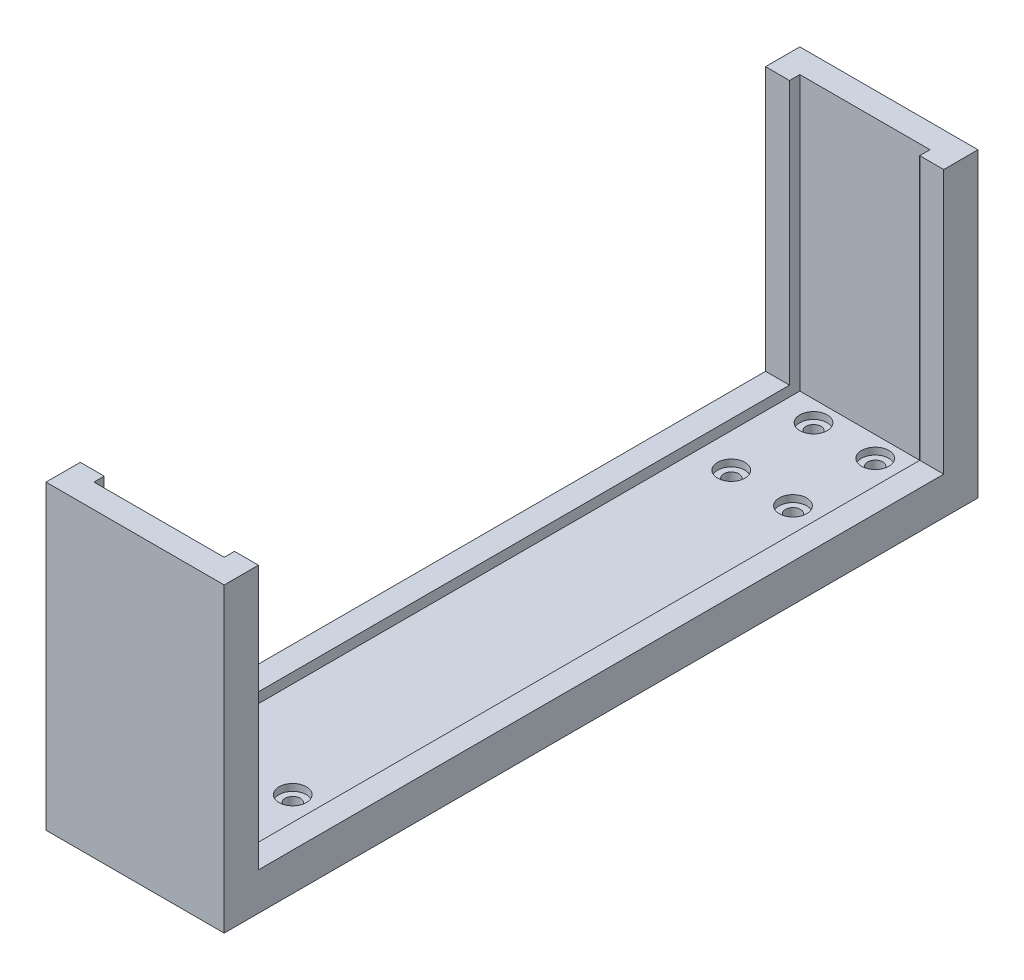
ISO-10303-21;
HEADER;
FILE_DESCRIPTION(('STEP AP214'),'2;1');
FILE_NAME('part.step','',(''),(''),'','','');
FILE_SCHEMA(('AUTOMOTIVE_DESIGN { 1 0 10303 214 1 1 1 1 }'));
ENDSEC;
DATA;
#1=APPLICATION_CONTEXT('core data for automotive mechanical design processes');
#2=APPLICATION_PROTOCOL_DEFINITION('international standard','automotive_design',2000,#1);
#3=PRODUCT_CONTEXT('',#1,'mechanical');
#4=PRODUCT('Part','Part','',(#3));
#5=PRODUCT_RELATED_PRODUCT_CATEGORY('part','',(#4));
#6=PRODUCT_DEFINITION_FORMATION('','',#4);
#7=PRODUCT_DEFINITION_CONTEXT('part definition',#1,'design');
#8=PRODUCT_DEFINITION('design','',#6,#7);
#9=PRODUCT_DEFINITION_SHAPE('','',#8);
#10=(LENGTH_UNIT() NAMED_UNIT(*) SI_UNIT(.MILLI.,.METRE.));
#11=(NAMED_UNIT(*) PLANE_ANGLE_UNIT() SI_UNIT($,.RADIAN.));
#12=(NAMED_UNIT(*) SI_UNIT($,.STERADIAN.) SOLID_ANGLE_UNIT());
#13=UNCERTAINTY_MEASURE_WITH_UNIT(LENGTH_MEASURE(1.E-05),#10,'distance_accuracy_value','');
#14=(GEOMETRIC_REPRESENTATION_CONTEXT(3) GLOBAL_UNCERTAINTY_ASSIGNED_CONTEXT((#13)) GLOBAL_UNIT_ASSIGNED_CONTEXT((#10,
#11,#12)) REPRESENTATION_CONTEXT('',''));
#15=CARTESIAN_POINT('',(0.,0.,0.));
#16=DIRECTION('',(0.,0.,1.));
#17=DIRECTION('',(1.,0.,0.));
#18=AXIS2_PLACEMENT_3D('',#15,#16,#17);
#19=CARTESIAN_POINT('',(24.761174554452,8.,154.057839406179));
#20=DIRECTION('',(0.,-1.,0.));
#21=DIRECTION('',(0.,0.,-1.));
#22=AXIS2_PLACEMENT_3D('',#19,#20,#21);
#23=CYLINDRICAL_SURFACE('',#22,2.2);
#24=CARTESIAN_POINT('',(24.761174554452,0.,154.057839406179));
#25=DIRECTION('',(0.,-1.,0.));
#26=DIRECTION('',(0.,0.,-1.));
#27=AXIS2_PLACEMENT_3D('',#24,#25,#26);
#28=CIRCLE('',#27,2.2);
#29=CARTESIAN_POINT('',(24.761174554452,0.,151.857839406179));
#30=VERTEX_POINT('',#29);
#31=EDGE_CURVE('E225',#30,#30,#28,.T.);
#32=ORIENTED_EDGE('',*,*,#31,.T.);
#33=EDGE_LOOP('',(#32));
#34=FACE_BOUND('',#33,.T.);
#35=CARTESIAN_POINT('',(24.761174554452,6.,154.057839406179));
#36=DIRECTION('',(0.,1.,0.));
#37=DIRECTION('',(0.,0.,1.));
#38=AXIS2_PLACEMENT_3D('',#35,#36,#37);
#39=CIRCLE('',#38,2.2);
#40=CARTESIAN_POINT('',(24.761174554452,6.,156.257839406179));
#41=VERTEX_POINT('',#40);
#42=EDGE_CURVE('E39',#41,#41,#39,.F.);
#43=ORIENTED_EDGE('',*,*,#42,.F.);
#44=EDGE_LOOP('',(#43));
#45=FACE_BOUND('',#44,.T.);
#46=ADVANCED_FACE('F35',(#34,#45),#23,.F.);
#47=CARTESIAN_POINT('',(24.7611745544548,8.,-39.9421605938213));
#48=DIRECTION('',(0.,-1.,0.));
#49=DIRECTION('',(0.,0.,-1.));
#50=AXIS2_PLACEMENT_3D('',#47,#48,#49);
#51=CYLINDRICAL_SURFACE('',#50,2.19999999999861);
#52=CARTESIAN_POINT('',(24.7611745544548,0.,-39.9421605938213));
#53=DIRECTION('',(0.,-1.,0.));
#54=DIRECTION('',(0.,0.,-1.));
#55=AXIS2_PLACEMENT_3D('',#52,#53,#54);
#56=CIRCLE('',#55,2.19999999999861);
#57=CARTESIAN_POINT('',(24.7611745544548,0.,-42.1421605938199));
#58=VERTEX_POINT('',#57);
#59=EDGE_CURVE('E212',#58,#58,#56,.T.);
#60=ORIENTED_EDGE('',*,*,#59,.T.);
#61=EDGE_LOOP('',(#60));
#62=FACE_BOUND('',#61,.T.);
#63=CARTESIAN_POINT('',(24.7611745544548,6.,-39.9421605938213));
#64=DIRECTION('',(0.,1.,0.));
#65=DIRECTION('',(0.,0.,1.));
#66=AXIS2_PLACEMENT_3D('',#63,#64,#65);
#67=CIRCLE('',#66,2.19999999999861);
#68=CARTESIAN_POINT('',(24.7611745544548,6.,-37.7421605938227));
#69=VERTEX_POINT('',#68);
#70=EDGE_CURVE('E172',#69,#69,#67,.F.);
#71=ORIENTED_EDGE('',*,*,#70,.F.);
#72=EDGE_LOOP('',(#71));
#73=FACE_BOUND('',#72,.T.);
#74=ADVANCED_FACE('F326',(#62,#73),#51,.F.);
#75=CARTESIAN_POINT('',(42.7611745544548,8.,-39.9421605938212));
#76=DIRECTION('',(0.,-1.,0.));
#77=DIRECTION('',(0.,0.,-1.));
#78=AXIS2_PLACEMENT_3D('',#75,#76,#77);
#79=CYLINDRICAL_SURFACE('',#78,2.19999999999861);
#80=CARTESIAN_POINT('',(42.7611745544548,0.,-39.9421605938212));
#81=DIRECTION('',(0.,-1.,0.));
#82=DIRECTION('',(0.,0.,-1.));
#83=AXIS2_PLACEMENT_3D('',#80,#81,#82);
#84=CIRCLE('',#83,2.19999999999861);
#85=CARTESIAN_POINT('',(42.7611745544548,0.,-42.1421605938198));
#86=VERTEX_POINT('',#85);
#87=EDGE_CURVE('E217',#86,#86,#84,.T.);
#88=ORIENTED_EDGE('',*,*,#87,.T.);
#89=EDGE_LOOP('',(#88));
#90=FACE_BOUND('',#89,.T.);
#91=CARTESIAN_POINT('',(42.7611745544548,6.,-39.9421605938212));
#92=DIRECTION('',(0.,1.,0.));
#93=DIRECTION('',(0.,0.,1.));
#94=AXIS2_PLACEMENT_3D('',#91,#92,#93);
#95=CIRCLE('',#94,2.19999999999861);
#96=CARTESIAN_POINT('',(42.7611745544548,6.,-37.7421605938226));
#97=VERTEX_POINT('',#96);
#98=EDGE_CURVE('E319',#97,#97,#95,.F.);
#99=ORIENTED_EDGE('',*,*,#98,.F.);
#100=EDGE_LOOP('',(#99));
#101=FACE_BOUND('',#100,.T.);
#102=ADVANCED_FACE('F328',(#90,#101),#79,.F.);
#103=CARTESIAN_POINT('',(42.7611745544546,8.,-15.9421605938212));
#104=DIRECTION('',(0.,-1.,0.));
#105=DIRECTION('',(0.,0.,-1.));
#106=AXIS2_PLACEMENT_3D('',#103,#104,#105);
#107=CYLINDRICAL_SURFACE('',#106,2.19999999999861);
#108=CARTESIAN_POINT('',(42.7611745544546,0.,-15.9421605938212));
#109=DIRECTION('',(0.,-1.,0.));
#110=DIRECTION('',(0.,0.,-1.));
#111=AXIS2_PLACEMENT_3D('',#108,#109,#110);
#112=CIRCLE('',#111,2.19999999999861);
#113=CARTESIAN_POINT('',(42.7611745544546,0.,-18.1421605938198));
#114=VERTEX_POINT('',#113);
#115=EDGE_CURVE('E213',#114,#114,#112,.T.);
#116=ORIENTED_EDGE('',*,*,#115,.T.);
#117=EDGE_LOOP('',(#116));
#118=FACE_BOUND('',#117,.T.);
#119=CARTESIAN_POINT('',(42.7611745544546,6.,-15.9421605938212));
#120=DIRECTION('',(0.,1.,0.));
#121=DIRECTION('',(0.,0.,1.));
#122=AXIS2_PLACEMENT_3D('',#119,#120,#121);
#123=CIRCLE('',#122,2.19999999999861);
#124=CARTESIAN_POINT('',(42.7611745544546,6.,-13.7421605938226));
#125=VERTEX_POINT('',#124);
#126=EDGE_CURVE('E316',#125,#125,#123,.F.);
#127=ORIENTED_EDGE('',*,*,#126,.F.);
#128=EDGE_LOOP('',(#127));
#129=FACE_BOUND('',#128,.T.);
#130=ADVANCED_FACE('F335',(#118,#129),#107,.F.);
#131=CARTESIAN_POINT('',(24.7611745544546,8.,-15.9421605938213));
#132=DIRECTION('',(0.,-1.,0.));
#133=DIRECTION('',(0.,0.,-1.));
#134=AXIS2_PLACEMENT_3D('',#131,#132,#133);
#135=CYLINDRICAL_SURFACE('',#134,2.19999999999861);
#136=CARTESIAN_POINT('',(24.7611745544546,0.,-15.9421605938213));
#137=DIRECTION('',(0.,-1.,0.));
#138=DIRECTION('',(0.,0.,-1.));
#139=AXIS2_PLACEMENT_3D('',#136,#137,#138);
#140=CIRCLE('',#139,2.19999999999861);
#141=CARTESIAN_POINT('',(24.7611745544546,0.,-18.1421605938199));
#142=VERTEX_POINT('',#141);
#143=EDGE_CURVE('E216',#142,#142,#140,.T.);
#144=ORIENTED_EDGE('',*,*,#143,.T.);
#145=EDGE_LOOP('',(#144));
#146=FACE_BOUND('',#145,.T.);
#147=CARTESIAN_POINT('',(24.7611745544546,6.,-15.9421605938213));
#148=DIRECTION('',(0.,1.,0.));
#149=DIRECTION('',(0.,0.,1.));
#150=AXIS2_PLACEMENT_3D('',#147,#148,#149);
#151=CIRCLE('',#150,2.19999999999861);
#152=CARTESIAN_POINT('',(24.7611745544546,6.,-13.7421605938227));
#153=VERTEX_POINT('',#152);
#154=EDGE_CURVE('E313',#153,#153,#151,.F.);
#155=ORIENTED_EDGE('',*,*,#154,.F.);
#156=EDGE_LOOP('',(#155));
#157=FACE_BOUND('',#156,.T.);
#158=ADVANCED_FACE('F354',(#146,#157),#135,.F.);
#159=CARTESIAN_POINT('',(24.7611745544522,8.,130.057839406179));
#160=DIRECTION('',(0.,-1.,0.));
#161=DIRECTION('',(0.,0.,-1.));
#162=AXIS2_PLACEMENT_3D('',#159,#160,#161);
#163=CYLINDRICAL_SURFACE('',#162,2.2);
#164=CARTESIAN_POINT('',(24.7611745544522,0.,130.057839406179));
#165=DIRECTION('',(0.,-1.,0.));
#166=DIRECTION('',(0.,0.,-1.));
#167=AXIS2_PLACEMENT_3D('',#164,#165,#166);
#168=CIRCLE('',#167,2.2);
#169=CARTESIAN_POINT('',(24.7611745544522,0.,127.857839406179));
#170=VERTEX_POINT('',#169);
#171=EDGE_CURVE('E229',#170,#170,#168,.T.);
#172=ORIENTED_EDGE('',*,*,#171,.T.);
#173=EDGE_LOOP('',(#172));
#174=FACE_BOUND('',#173,.T.);
#175=CARTESIAN_POINT('',(24.7611745544522,6.,130.057839406179));
#176=DIRECTION('',(0.,1.,0.));
#177=DIRECTION('',(0.,0.,1.));
#178=AXIS2_PLACEMENT_3D('',#175,#176,#177);
#179=CIRCLE('',#178,2.2);
#180=CARTESIAN_POINT('',(24.7611745544522,6.,132.257839406179));
#181=VERTEX_POINT('',#180);
#182=EDGE_CURVE('E310',#181,#181,#179,.F.);
#183=ORIENTED_EDGE('',*,*,#182,.F.);
#184=EDGE_LOOP('',(#183));
#185=FACE_BOUND('',#184,.T.);
#186=ADVANCED_FACE('F350',(#174,#185),#163,.F.);
#187=CARTESIAN_POINT('',(42.7611745544522,8.,130.057839406179));
#188=DIRECTION('',(0.,-1.,0.));
#189=DIRECTION('',(0.,0.,-1.));
#190=AXIS2_PLACEMENT_3D('',#187,#188,#189);
#191=CYLINDRICAL_SURFACE('',#190,2.2);
#192=CARTESIAN_POINT('',(42.7611745544522,0.,130.057839406179));
#193=DIRECTION('',(0.,-1.,0.));
#194=DIRECTION('',(0.,0.,-1.));
#195=AXIS2_PLACEMENT_3D('',#192,#193,#194);
#196=CIRCLE('',#195,2.2);
#197=CARTESIAN_POINT('',(42.7611745544522,0.,127.857839406179));
#198=VERTEX_POINT('',#197);
#199=EDGE_CURVE('E226',#198,#198,#196,.T.);
#200=ORIENTED_EDGE('',*,*,#199,.T.);
#201=EDGE_LOOP('',(#200));
#202=FACE_BOUND('',#201,.T.);
#203=CARTESIAN_POINT('',(42.7611745544522,6.,130.057839406179));
#204=DIRECTION('',(0.,1.,0.));
#205=DIRECTION('',(0.,0.,1.));
#206=AXIS2_PLACEMENT_3D('',#203,#204,#205);
#207=CIRCLE('',#206,2.2);
#208=CARTESIAN_POINT('',(42.7611745544522,6.,132.257839406179));
#209=VERTEX_POINT('',#208);
#210=EDGE_CURVE('E306',#209,#209,#207,.F.);
#211=ORIENTED_EDGE('',*,*,#210,.F.);
#212=EDGE_LOOP('',(#211));
#213=FACE_BOUND('',#212,.T.);
#214=ADVANCED_FACE('F346',(#202,#213),#191,.F.);
#215=CARTESIAN_POINT('',(42.761174554452,8.,154.057839406179));
#216=DIRECTION('',(0.,-1.,0.));
#217=DIRECTION('',(0.,0.,-1.));
#218=AXIS2_PLACEMENT_3D('',#215,#216,#217);
#219=CYLINDRICAL_SURFACE('',#218,2.2);
#220=CARTESIAN_POINT('',(42.761174554452,0.,154.057839406179));
#221=DIRECTION('',(0.,-1.,0.));
#222=DIRECTION('',(0.,0.,-1.));
#223=AXIS2_PLACEMENT_3D('',#220,#221,#222);
#224=CIRCLE('',#223,2.2);
#225=CARTESIAN_POINT('',(42.761174554452,0.,151.857839406179));
#226=VERTEX_POINT('',#225);
#227=EDGE_CURVE('E222',#226,#226,#224,.T.);
#228=ORIENTED_EDGE('',*,*,#227,.T.);
#229=EDGE_LOOP('',(#228));
#230=FACE_BOUND('',#229,.T.);
#231=CARTESIAN_POINT('',(42.761174554452,6.,154.057839406179));
#232=DIRECTION('',(0.,1.,0.));
#233=DIRECTION('',(0.,0.,1.));
#234=AXIS2_PLACEMENT_3D('',#231,#232,#233);
#235=CIRCLE('',#234,2.2);
#236=CARTESIAN_POINT('',(42.761174554452,6.,156.257839406179));
#237=VERTEX_POINT('',#236);
#238=EDGE_CURVE('E303',#237,#237,#235,.F.);
#239=ORIENTED_EDGE('',*,*,#238,.F.);
#240=EDGE_LOOP('',(#239));
#241=FACE_BOUND('',#240,.T.);
#242=ADVANCED_FACE('F342',(#230,#241),#219,.F.);
#243=CARTESIAN_POINT('',(0.,8.,0.));
#244=DIRECTION('',(0.,1.,0.));
#245=DIRECTION('',(0.,0.,1.));
#246=AXIS2_PLACEMENT_3D('',#243,#244,#245);
#247=PLANE('',#246);
#248=CARTESIAN_POINT('',(24.761174554452,8.,154.057839406179));
#249=DIRECTION('',(0.,1.,0.));
#250=DIRECTION('',(0.,0.,1.));
#251=AXIS2_PLACEMENT_3D('',#248,#249,#250);
#252=CIRCLE('',#251,4.);
#253=CARTESIAN_POINT('',(24.761174554452,8.,158.057839406179));
#254=VERTEX_POINT('',#253);
#255=EDGE_CURVE('E743',#254,#254,#252,.T.);
#256=ORIENTED_EDGE('',*,*,#255,.F.);
#257=EDGE_LOOP('',(#256));
#258=FACE_BOUND('',#257,.T.);
#259=CARTESIAN_POINT('',(24.7611745544522,8.,130.057839406179));
#260=DIRECTION('',(0.,1.,0.));
#261=DIRECTION('',(0.,0.,1.));
#262=AXIS2_PLACEMENT_3D('',#259,#260,#261);
#263=CIRCLE('',#262,4.);
#264=CARTESIAN_POINT('',(24.7611745544522,8.,134.057839406179));
#265=VERTEX_POINT('',#264);
#266=EDGE_CURVE('E749',#265,#265,#263,.T.);
#267=ORIENTED_EDGE('',*,*,#266,.F.);
#268=EDGE_LOOP('',(#267));
#269=FACE_BOUND('',#268,.T.);
#270=CARTESIAN_POINT('',(42.7611745544522,8.,130.057839406179));
#271=DIRECTION('',(0.,1.,0.));
#272=DIRECTION('',(0.,0.,1.));
#273=AXIS2_PLACEMENT_3D('',#270,#271,#272);
#274=CIRCLE('',#273,4.00000000000001);
#275=CARTESIAN_POINT('',(42.7611745544522,8.,134.057839406179));
#276=VERTEX_POINT('',#275);
#277=EDGE_CURVE('E758',#276,#276,#274,.T.);
#278=ORIENTED_EDGE('',*,*,#277,.F.);
#279=EDGE_LOOP('',(#278));
#280=FACE_BOUND('',#279,.T.);
#281=CARTESIAN_POINT('',(42.7611745544546,8.,-15.9421605938212));
#282=DIRECTION('',(0.,1.,0.));
#283=DIRECTION('',(0.,0.,1.));
#284=AXIS2_PLACEMENT_3D('',#281,#282,#283);
#285=CIRCLE('',#284,4.00000000000001);
#286=CARTESIAN_POINT('',(42.7611745544546,8.,-11.9421605938212));
#287=VERTEX_POINT('',#286);
#288=EDGE_CURVE('E763',#287,#287,#285,.T.);
#289=ORIENTED_EDGE('',*,*,#288,.F.);
#290=EDGE_LOOP('',(#289));
#291=FACE_BOUND('',#290,.T.);
#292=CARTESIAN_POINT('',(24.7611745544546,8.,-15.9421605938213));
#293=DIRECTION('',(0.,1.,0.));
#294=DIRECTION('',(0.,0.,1.));
#295=AXIS2_PLACEMENT_3D('',#292,#293,#294);
#296=CIRCLE('',#295,4.);
#297=CARTESIAN_POINT('',(24.7611745544546,8.,-11.9421605938213));
#298=VERTEX_POINT('',#297);
#299=EDGE_CURVE('E779',#298,#298,#296,.T.);
#300=ORIENTED_EDGE('',*,*,#299,.F.);
#301=EDGE_LOOP('',(#300));
#302=FACE_BOUND('',#301,.T.);
#303=CARTESIAN_POINT('',(24.7611745544548,8.,-39.9421605938213));
#304=DIRECTION('',(0.,1.,0.));
#305=DIRECTION('',(0.,0.,1.));
#306=AXIS2_PLACEMENT_3D('',#303,#304,#305);
#307=CIRCLE('',#306,4.);
#308=CARTESIAN_POINT('',(24.7611745544548,8.,-35.9421605938213));
#309=VERTEX_POINT('',#308);
#310=EDGE_CURVE('E788',#309,#309,#307,.T.);
#311=ORIENTED_EDGE('',*,*,#310,.F.);
#312=EDGE_LOOP('',(#311));
#313=FACE_BOUND('',#312,.T.);
#314=CARTESIAN_POINT('',(42.7611745544548,8.,-39.9421605938212));
#315=DIRECTION('',(0.,1.,0.));
#316=DIRECTION('',(0.,0.,1.));
#317=AXIS2_PLACEMENT_3D('',#314,#315,#316);
#318=CIRCLE('',#317,4.00000000000001);
#319=CARTESIAN_POINT('',(42.7611745544548,8.,-35.9421605938212));
#320=VERTEX_POINT('',#319);
#321=EDGE_CURVE('E793',#320,#320,#318,.T.);
#322=ORIENTED_EDGE('',*,*,#321,.F.);
#323=EDGE_LOOP('',(#322));
#324=FACE_BOUND('',#323,.T.);
#325=CARTESIAN_POINT('',(42.7611745544535,8.,154.057839406179));
#326=DIRECTION('',(0.,1.,0.));
#327=DIRECTION('',(0.,0.,1.));
#328=AXIS2_PLACEMENT_3D('',#325,#326,#327);
#329=CIRCLE('',#328,4.00000000000001);
#330=CARTESIAN_POINT('',(42.7611745544535,8.,158.057839406179));
#331=VERTEX_POINT('',#330);
#332=EDGE_CURVE('E746',#331,#331,#329,.T.);
#333=ORIENTED_EDGE('',*,*,#332,.F.);
#334=EDGE_LOOP('',(#333));
#335=FACE_BOUND('',#334,.T.);
#336=DIRECTION('',(1.,0.,0.));
#337=VECTOR('',#336,1.);
#338=CARTESIAN_POINT('',(59.7611745544525,8.,-45.9421605938198));
#339=LINE('',#338,#337);
#340=CARTESIAN_POINT('',(14.7611745544525,8.,-45.9421605938198));
#341=VERTEX_POINT('',#340);
#342=CARTESIAN_POINT('',(52.7611745544525,8.,-45.9421605938198));
#343=VERTEX_POINT('',#342);
#344=EDGE_CURVE('E245',#341,#343,#339,.T.);
#345=ORIENTED_EDGE('',*,*,#344,.F.);
#346=DIRECTION('',(0.,0.,-1.));
#347=VECTOR('',#346,1.);
#348=CARTESIAN_POINT('',(14.7611745544525,8.,-52.9421605938198));
#349=LINE('',#348,#347);
#350=CARTESIAN_POINT('',(14.7611745544525,8.,160.05783940618));
#351=VERTEX_POINT('',#350);
#352=EDGE_CURVE('E265',#351,#341,#349,.T.);
#353=ORIENTED_EDGE('',*,*,#352,.F.);
#354=DIRECTION('',(-1.,0.,0.));
#355=VECTOR('',#354,1.);
#356=CARTESIAN_POINT('',(59.7611745544525,8.,160.05783940618));
#357=LINE('',#356,#355);
#358=CARTESIAN_POINT('',(52.7611745544525,8.,160.05783940618));
#359=VERTEX_POINT('',#358);
#360=EDGE_CURVE('E257',#359,#351,#357,.T.);
#361=ORIENTED_EDGE('',*,*,#360,.F.);
#362=DIRECTION('',(0.,0.,1.));
#363=VECTOR('',#362,1.);
#364=CARTESIAN_POINT('',(52.7611745544525,8.,-45.9421605938198));
#365=LINE('',#364,#363);
#366=EDGE_CURVE('E203',#343,#359,#365,.T.);
#367=ORIENTED_EDGE('',*,*,#366,.F.);
#368=EDGE_LOOP('',(#345,#353,#361,#367));
#369=FACE_BOUND('',#368,.T.);
#370=ADVANCED_FACE('F345',(#258,#269,#280,#291,#302,#313,#324,#335,#369),#247,.T.);
#371=CARTESIAN_POINT('',(17.7611745544525,88.,-42.9421605938198));
#372=DIRECTION('',(0.,0.,-1.));
#373=DIRECTION('',(0.,1.,0.));
#374=AXIS2_PLACEMENT_3D('',#371,#372,#373);
#375=PLANE('',#374);
#376=DIRECTION('',(-1.,0.,0.));
#377=VECTOR('',#376,1.);
#378=CARTESIAN_POINT('',(14.7611745544525,11.,-42.9421605938198));
#379=LINE('',#378,#377);
#380=CARTESIAN_POINT('',(14.7611745544525,11.,-42.9421605938198));
#381=VERTEX_POINT('',#380);
#382=CARTESIAN_POINT('',(7.76117455445247,11.,-42.9421605938198));
#383=VERTEX_POINT('',#382);
#384=EDGE_CURVE('E194',#381,#383,#379,.T.);
#385=ORIENTED_EDGE('',*,*,#384,.F.);
#386=DIRECTION('',(0.,-1.,0.));
#387=VECTOR('',#386,1.);
#388=CARTESIAN_POINT('',(14.7611745544525,88.,-42.9421605938198));
#389=LINE('',#388,#387);
#390=CARTESIAN_POINT('',(14.7611745544525,88.,-42.9421605938198));
#391=VERTEX_POINT('',#390);
#392=EDGE_CURVE('E242',#391,#381,#389,.T.);
#393=ORIENTED_EDGE('',*,*,#392,.F.);
#394=DIRECTION('',(-1.,0.,0.));
#395=VECTOR('',#394,1.);
#396=CARTESIAN_POINT('',(0.,88.,-42.9421605938198));
#397=LINE('',#396,#395);
#398=CARTESIAN_POINT('',(7.76117455445247,88.,-42.9421605938198));
#399=VERTEX_POINT('',#398);
#400=EDGE_CURVE('E11',#391,#399,#397,.T.);
#401=ORIENTED_EDGE('',*,*,#400,.T.);
#402=DIRECTION('',(0.,-1.,0.));
#403=VECTOR('',#402,1.);
#404=CARTESIAN_POINT('',(7.76117455445247,88.,-42.9421605938198));
#405=LINE('',#404,#403);
#406=EDGE_CURVE('E236',#399,#383,#405,.T.);
#407=ORIENTED_EDGE('',*,*,#406,.T.);
#408=EDGE_LOOP('',(#385,#393,#401,#407));
#409=FACE_BOUND('',#408,.T.);
#410=ADVANCED_FACE('F363',(#409),#375,.F.);
#411=CARTESIAN_POINT('',(17.7611745544525,88.,157.05783940618));
#412=DIRECTION('',(0.,0.,1.));
#413=DIRECTION('',(1.,0.,0.));
#414=AXIS2_PLACEMENT_3D('',#411,#412,#413);
#415=PLANE('',#414);
#416=DIRECTION('',(1.,0.,0.));
#417=VECTOR('',#416,1.);
#418=CARTESIAN_POINT('',(14.7611745544525,11.,157.05783940618));
#419=LINE('',#418,#417);
#420=CARTESIAN_POINT('',(7.76117455445247,11.,157.05783940618));
#421=VERTEX_POINT('',#420);
#422=CARTESIAN_POINT('',(14.7611745544525,11.,157.05783940618));
#423=VERTEX_POINT('',#422);
#424=EDGE_CURVE('E200',#421,#423,#419,.T.);
#425=ORIENTED_EDGE('',*,*,#424,.F.);
#426=DIRECTION('',(0.,1.,0.));
#427=VECTOR('',#426,1.);
#428=CARTESIAN_POINT('',(7.76117455445247,88.,157.05783940618));
#429=LINE('',#428,#427);
#430=CARTESIAN_POINT('',(7.76117455445247,88.,157.05783940618));
#431=VERTEX_POINT('',#430);
#432=EDGE_CURVE('E238',#421,#431,#429,.T.);
#433=ORIENTED_EDGE('',*,*,#432,.T.);
#434=DIRECTION('',(1.,0.,0.));
#435=VECTOR('',#434,1.);
#436=CARTESIAN_POINT('',(0.,88.,157.05783940618));
#437=LINE('',#436,#435);
#438=CARTESIAN_POINT('',(14.7611745544525,88.,157.05783940618));
#439=VERTEX_POINT('',#438);
#440=EDGE_CURVE('E44',#431,#439,#437,.T.);
#441=ORIENTED_EDGE('',*,*,#440,.T.);
#442=DIRECTION('',(0.,1.,0.));
#443=VECTOR('',#442,1.);
#444=CARTESIAN_POINT('',(14.7611745544525,88.,157.05783940618));
#445=LINE('',#444,#443);
#446=EDGE_CURVE('E240',#423,#439,#445,.T.);
#447=ORIENTED_EDGE('',*,*,#446,.F.);
#448=EDGE_LOOP('',(#425,#433,#441,#447));
#449=FACE_BOUND('',#448,.T.);
#450=ADVANCED_FACE('F359',(#449),#415,.F.);
#451=CARTESIAN_POINT('',(59.7611745544525,88.,160.05783940618));
#452=DIRECTION('',(0.,0.,1.));
#453=DIRECTION('',(1.,0.,0.));
#454=AXIS2_PLACEMENT_3D('',#451,#452,#453);
#455=PLANE('',#454);
#456=DIRECTION('',(-1.,0.,0.));
#457=VECTOR('',#456,1.);
#458=CARTESIAN_POINT('',(59.7611745544525,88.,160.05783940618));
#459=LINE('',#458,#457);
#460=CARTESIAN_POINT('',(52.7611745544525,88.,160.05783940618));
#461=VERTEX_POINT('',#460);
#462=CARTESIAN_POINT('',(14.7611745544525,88.,160.05783940618));
#463=VERTEX_POINT('',#462);
#464=EDGE_CURVE('E259',#461,#463,#459,.T.);
#465=ORIENTED_EDGE('',*,*,#464,.F.);
#466=DIRECTION('',(0.,-1.,0.));
#467=VECTOR('',#466,1.);
#468=CARTESIAN_POINT('',(52.7611745544525,11.,160.05783940618));
#469=LINE('',#468,#467);
#470=EDGE_CURVE('E52',#461,#359,#469,.T.);
#471=ORIENTED_EDGE('',*,*,#470,.T.);
#472=ORIENTED_EDGE('',*,*,#360,.T.);
#473=DIRECTION('',(0.,-1.,0.));
#474=VECTOR('',#473,1.);
#475=CARTESIAN_POINT('',(14.7611745544525,88.,160.05783940618));
#476=LINE('',#475,#474);
#477=EDGE_CURVE('E261',#463,#351,#476,.T.);
#478=ORIENTED_EDGE('',*,*,#477,.F.);
#479=EDGE_LOOP('',(#465,#471,#472,#478));
#480=FACE_BOUND('',#479,.T.);
#481=ADVANCED_FACE('F362',(#480),#455,.F.);
#482=CARTESIAN_POINT('',(59.7611745544525,88.,-45.9421605938198));
#483=DIRECTION('',(0.,0.,-1.));
#484=DIRECTION('',(-1.,0.,0.));
#485=AXIS2_PLACEMENT_3D('',#482,#483,#484);
#486=PLANE('',#485);
#487=DIRECTION('',(0.,-1.,0.));
#488=VECTOR('',#487,1.);
#489=CARTESIAN_POINT('',(52.7611745544525,11.,-45.9421605938198));
#490=LINE('',#489,#488);
#491=CARTESIAN_POINT('',(52.7611745544525,88.,-45.9421605938198));
#492=VERTEX_POINT('',#491);
#493=EDGE_CURVE('E209',#492,#343,#490,.T.);
#494=ORIENTED_EDGE('',*,*,#493,.F.);
#495=DIRECTION('',(1.,0.,0.));
#496=VECTOR('',#495,1.);
#497=CARTESIAN_POINT('',(59.7611745544525,88.,-45.9421605938198));
#498=LINE('',#497,#496);
#499=CARTESIAN_POINT('',(14.7611745544525,88.,-45.9421605938198));
#500=VERTEX_POINT('',#499);
#501=EDGE_CURVE('E249',#500,#492,#498,.T.);
#502=ORIENTED_EDGE('',*,*,#501,.F.);
#503=DIRECTION('',(0.,-1.,0.));
#504=VECTOR('',#503,1.);
#505=CARTESIAN_POINT('',(14.7611745544525,88.,-45.9421605938198));
#506=LINE('',#505,#504);
#507=EDGE_CURVE('E252',#500,#341,#506,.T.);
#508=ORIENTED_EDGE('',*,*,#507,.T.);
#509=ORIENTED_EDGE('',*,*,#344,.T.);
#510=EDGE_LOOP('',(#494,#502,#508,#509));
#511=FACE_BOUND('',#510,.T.);
#512=ADVANCED_FACE('F368',(#511),#486,.F.);
#513=CARTESIAN_POINT('',(0.,88.,0.));
#514=DIRECTION('',(0.,1.,0.));
#515=DIRECTION('',(0.,0.,1.));
#516=AXIS2_PLACEMENT_3D('',#513,#514,#515);
#517=PLANE('',#516);
#518=ORIENTED_EDGE('',*,*,#400,.F.);
#519=DIRECTION('',(0.,0.,-1.));
#520=VECTOR('',#519,1.);
#521=CARTESIAN_POINT('',(14.7611745544525,88.,-52.9421605938198));
#522=LINE('',#521,#520);
#523=EDGE_CURVE('E272',#391,#500,#522,.T.);
#524=ORIENTED_EDGE('',*,*,#523,.T.);
#525=ORIENTED_EDGE('',*,*,#501,.T.);
#526=DIRECTION('',(0.,0.,1.));
#527=VECTOR('',#526,1.);
#528=CARTESIAN_POINT('',(52.7611745544525,88.,-45.9421605938198));
#529=LINE('',#528,#527);
#530=CARTESIAN_POINT('',(52.7611745544525,88.,-42.9421605938198));
#531=VERTEX_POINT('',#530);
#532=EDGE_CURVE('E177',#492,#531,#529,.T.);
#533=ORIENTED_EDGE('',*,*,#532,.T.);
#534=DIRECTION('',(1.,0.,0.));
#535=VECTOR('',#534,1.);
#536=CARTESIAN_POINT('',(59.7611745544525,88.,-42.9421605938198));
#537=LINE('',#536,#535);
#538=CARTESIAN_POINT('',(59.7611745544525,88.,-42.9421605938198));
#539=VERTEX_POINT('',#538);
#540=EDGE_CURVE('E178',#531,#539,#537,.T.);
#541=ORIENTED_EDGE('',*,*,#540,.T.);
#542=DIRECTION('',(0.,0.,-1.));
#543=VECTOR('',#542,1.);
#544=CARTESIAN_POINT('',(59.7611745544525,88.,-52.9421605938198));
#545=LINE('',#544,#543);
#546=CARTESIAN_POINT('',(59.7611745544525,88.,-52.9421605938198));
#547=VERTEX_POINT('',#546);
#548=EDGE_CURVE('E246',#539,#547,#545,.T.);
#549=ORIENTED_EDGE('',*,*,#548,.T.);
#550=DIRECTION('',(-1.,0.,0.));
#551=VECTOR('',#550,1.);
#552=CARTESIAN_POINT('',(7.76117455445247,88.,-52.9421605938198));
#553=LINE('',#552,#551);
#554=CARTESIAN_POINT('',(7.76117455445247,88.,-52.9421605938198));
#555=VERTEX_POINT('',#554);
#556=EDGE_CURVE('E276',#547,#555,#553,.T.);
#557=ORIENTED_EDGE('',*,*,#556,.T.);
#558=DIRECTION('',(0.,0.,1.));
#559=VECTOR('',#558,1.);
#560=CARTESIAN_POINT('',(7.76117455445247,88.,-52.9421605938198));
#561=LINE('',#560,#559);
#562=EDGE_CURVE('E266',#555,#399,#561,.T.);
#563=ORIENTED_EDGE('',*,*,#562,.T.);
#564=EDGE_LOOP('',(#518,#524,#525,#533,#541,#549,#557,#563));
#565=FACE_BOUND('',#564,.T.);
#566=ADVANCED_FACE('F371',(#565),#517,.T.);
#567=CARTESIAN_POINT('',(14.7611745544525,88.,-52.9421605938198));
#568=DIRECTION('',(-1.,0.,0.));
#569=DIRECTION('',(0.,0.,1.));
#570=AXIS2_PLACEMENT_3D('',#567,#568,#569);
#571=PLANE('',#570);
#572=ORIENTED_EDGE('',*,*,#352,.T.);
#573=ORIENTED_EDGE('',*,*,#507,.F.);
#574=ORIENTED_EDGE('',*,*,#523,.F.);
#575=ORIENTED_EDGE('',*,*,#392,.T.);
#576=DIRECTION('',(0.,0.,-1.));
#577=VECTOR('',#576,1.);
#578=CARTESIAN_POINT('',(14.7611745544525,11.,-42.9421605938198));
#579=LINE('',#578,#577);
#580=EDGE_CURVE('E190',#423,#381,#579,.T.);
#581=ORIENTED_EDGE('',*,*,#580,.F.);
#582=ORIENTED_EDGE('',*,*,#446,.T.);
#583=EDGE_CURVE('E273',#463,#439,#522,.T.);
#584=ORIENTED_EDGE('',*,*,#583,.F.);
#585=ORIENTED_EDGE('',*,*,#477,.T.);
#586=EDGE_LOOP('',(#572,#573,#574,#575,#581,#582,#584,#585));
#587=FACE_BOUND('',#586,.T.);
#588=ADVANCED_FACE('F379',(#587),#571,.F.);
#589=CARTESIAN_POINT('',(7.76117455445247,8.,-52.9421605938198));
#590=DIRECTION('',(1.,0.,0.));
#591=DIRECTION('',(0.,0.,-1.));
#592=AXIS2_PLACEMENT_3D('',#589,#590,#591);
#593=PLANE('',#592);
#594=DIRECTION('',(0.,0.,1.));
#595=VECTOR('',#594,1.);
#596=CARTESIAN_POINT('',(7.76117455445247,11.,-42.9421605938198));
#597=LINE('',#596,#595);
#598=EDGE_CURVE('E197',#383,#421,#597,.T.);
#599=ORIENTED_EDGE('',*,*,#598,.F.);
#600=ORIENTED_EDGE('',*,*,#406,.F.);
#601=ORIENTED_EDGE('',*,*,#562,.F.);
#602=DIRECTION('',(0.,-1.,0.));
#603=VECTOR('',#602,1.);
#604=CARTESIAN_POINT('',(7.76117455445247,8.,-52.9421605938198));
#605=LINE('',#604,#603);
#606=CARTESIAN_POINT('',(7.76117455445247,0.,-52.9421605938198));
#607=VERTEX_POINT('',#606);
#608=EDGE_CURVE('E289',#555,#607,#605,.T.);
#609=ORIENTED_EDGE('',*,*,#608,.T.);
#610=DIRECTION('',(0.,0.,1.));
#611=VECTOR('',#610,1.);
#612=CARTESIAN_POINT('',(7.76117455445247,0.,-52.9421605938198));
#613=LINE('',#612,#611);
#614=CARTESIAN_POINT('',(7.76117455445247,0.,167.05783940618));
#615=VERTEX_POINT('',#614);
#616=EDGE_CURVE('E279',#607,#615,#613,.T.);
#617=ORIENTED_EDGE('',*,*,#616,.T.);
#618=DIRECTION('',(0.,-1.,0.));
#619=VECTOR('',#618,1.);
#620=CARTESIAN_POINT('',(7.76117455445247,8.,167.05783940618));
#621=LINE('',#620,#619);
#622=CARTESIAN_POINT('',(7.76117455445247,88.,167.05783940618));
#623=VERTEX_POINT('',#622);
#624=EDGE_CURVE('E298',#623,#615,#621,.T.);
#625=ORIENTED_EDGE('',*,*,#624,.F.);
#626=EDGE_CURVE('E270',#431,#623,#561,.T.);
#627=ORIENTED_EDGE('',*,*,#626,.F.);
#628=ORIENTED_EDGE('',*,*,#432,.F.);
#629=EDGE_LOOP('',(#599,#600,#601,#609,#617,#625,#627,#628));
#630=FACE_BOUND('',#629,.T.);
#631=ADVANCED_FACE('F37',(#630),#593,.F.);
#632=CARTESIAN_POINT('',(7.76117455445247,8.,167.05783940618));
#633=DIRECTION('',(0.,0.,-1.));
#634=DIRECTION('',(-1.,0.,0.));
#635=AXIS2_PLACEMENT_3D('',#632,#633,#634);
#636=PLANE('',#635);
#637=DIRECTION('',(0.,-1.,0.));
#638=VECTOR('',#637,1.);
#639=CARTESIAN_POINT('',(59.7611745544525,8.,167.05783940618));
#640=LINE('',#639,#638);
#641=CARTESIAN_POINT('',(59.7611745544525,88.,167.05783940618));
#642=VERTEX_POINT('',#641);
#643=CARTESIAN_POINT('',(59.7611745544525,0.,167.05783940618));
#644=VERTEX_POINT('',#643);
#645=EDGE_CURVE('E295',#642,#644,#640,.T.);
#646=ORIENTED_EDGE('',*,*,#645,.F.);
#647=DIRECTION('',(1.,0.,0.));
#648=VECTOR('',#647,1.);
#649=CARTESIAN_POINT('',(7.76117455445247,88.,167.05783940618));
#650=LINE('',#649,#648);
#651=EDGE_CURVE('E269',#623,#642,#650,.T.);
#652=ORIENTED_EDGE('',*,*,#651,.F.);
#653=ORIENTED_EDGE('',*,*,#624,.T.);
#654=DIRECTION('',(1.,0.,0.));
#655=VECTOR('',#654,1.);
#656=CARTESIAN_POINT('',(7.76117455445247,0.,167.05783940618));
#657=LINE('',#656,#655);
#658=EDGE_CURVE('E283',#615,#644,#657,.T.);
#659=ORIENTED_EDGE('',*,*,#658,.T.);
#660=EDGE_LOOP('',(#646,#652,#653,#659));
#661=FACE_BOUND('',#660,.T.);
#662=ADVANCED_FACE('F395',(#661),#636,.F.);
#663=CARTESIAN_POINT('',(59.7611745544525,8.,-52.9421605938198));
#664=DIRECTION('',(-1.,0.,0.));
#665=DIRECTION('',(0.,0.,1.));
#666=AXIS2_PLACEMENT_3D('',#663,#664,#665);
#667=PLANE('',#666);
#668=DIRECTION('',(0.,0.,-1.));
#669=VECTOR('',#668,1.);
#670=CARTESIAN_POINT('',(59.7611745544525,0.,-52.9421605938198));
#671=LINE('',#670,#669);
#672=CARTESIAN_POINT('',(59.7611745544525,0.,-52.9421605938198));
#673=VERTEX_POINT('',#672);
#674=EDGE_CURVE('E285',#644,#673,#671,.T.);
#675=ORIENTED_EDGE('',*,*,#674,.T.);
#676=DIRECTION('',(0.,-1.,0.));
#677=VECTOR('',#676,1.);
#678=CARTESIAN_POINT('',(59.7611745544525,8.,-52.9421605938198));
#679=LINE('',#678,#677);
#680=EDGE_CURVE('E292',#547,#673,#679,.T.);
#681=ORIENTED_EDGE('',*,*,#680,.F.);
#682=ORIENTED_EDGE('',*,*,#548,.F.);
#683=DIRECTION('',(0.,1.,0.));
#684=VECTOR('',#683,1.);
#685=CARTESIAN_POINT('',(59.7611745544525,3.38422689413605,-42.9421605938198));
#686=LINE('',#685,#684);
#687=CARTESIAN_POINT('',(59.7611745544525,11.,-42.9421605938198));
#688=VERTEX_POINT('',#687);
#689=EDGE_CURVE('E187',#688,#539,#686,.T.);
#690=ORIENTED_EDGE('',*,*,#689,.F.);
#691=DIRECTION('',(0.,0.,-1.));
#692=VECTOR('',#691,1.);
#693=CARTESIAN_POINT('',(59.7611745544525,11.,-45.9421605938198));
#694=LINE('',#693,#692);
#695=CARTESIAN_POINT('',(59.7611745544525,11.,157.05783940618));
#696=VERTEX_POINT('',#695);
#697=EDGE_CURVE('E204',#696,#688,#694,.T.);
#698=ORIENTED_EDGE('',*,*,#697,.F.);
#699=DIRECTION('',(0.,1.,0.));
#700=VECTOR('',#699,1.);
#701=CARTESIAN_POINT('',(59.7611745544525,3.38422689413605,157.05783940618));
#702=LINE('',#701,#700);
#703=CARTESIAN_POINT('',(59.7611745544525,88.,157.05783940618));
#704=VERTEX_POINT('',#703);
#705=EDGE_CURVE('E157',#696,#704,#702,.T.);
#706=ORIENTED_EDGE('',*,*,#705,.T.);
#707=DIRECTION('',(0.,0.,-1.));
#708=VECTOR('',#707,1.);
#709=CARTESIAN_POINT('',(59.7611745544525,88.,167.05783940618));
#710=LINE('',#709,#708);
#711=EDGE_CURVE('E168',#642,#704,#710,.T.);
#712=ORIENTED_EDGE('',*,*,#711,.F.);
#713=ORIENTED_EDGE('',*,*,#645,.T.);
#714=EDGE_LOOP('',(#675,#681,#682,#690,#698,#706,#712,#713));
#715=FACE_BOUND('',#714,.T.);
#716=ADVANCED_FACE('F392',(#715),#667,.F.);
#717=CARTESIAN_POINT('',(7.76117455445247,8.,-52.9421605938198));
#718=DIRECTION('',(0.,0.,1.));
#719=DIRECTION('',(1.,0.,0.));
#720=AXIS2_PLACEMENT_3D('',#717,#718,#719);
#721=PLANE('',#720);
#722=DIRECTION('',(-1.,0.,0.));
#723=VECTOR('',#722,1.);
#724=CARTESIAN_POINT('',(7.76117455445247,0.,-52.9421605938198));
#725=LINE('',#724,#723);
#726=EDGE_CURVE('E287',#673,#607,#725,.T.);
#727=ORIENTED_EDGE('',*,*,#726,.T.);
#728=ORIENTED_EDGE('',*,*,#608,.F.);
#729=ORIENTED_EDGE('',*,*,#556,.F.);
#730=ORIENTED_EDGE('',*,*,#680,.T.);
#731=EDGE_LOOP('',(#727,#728,#729,#730));
#732=FACE_BOUND('',#731,.T.);
#733=ADVANCED_FACE('F388',(#732),#721,.F.);
#734=CARTESIAN_POINT('',(0.,0.,0.));
#735=DIRECTION('',(0.,1.,0.));
#736=DIRECTION('',(0.,0.,1.));
#737=AXIS2_PLACEMENT_3D('',#734,#735,#736);
#738=PLANE('',#737);
#739=ORIENTED_EDGE('',*,*,#227,.F.);
#740=EDGE_LOOP('',(#739));
#741=FACE_BOUND('',#740,.T.);
#742=ORIENTED_EDGE('',*,*,#199,.F.);
#743=EDGE_LOOP('',(#742));
#744=FACE_BOUND('',#743,.T.);
#745=ORIENTED_EDGE('',*,*,#171,.F.);
#746=EDGE_LOOP('',(#745));
#747=FACE_BOUND('',#746,.T.);
#748=ORIENTED_EDGE('',*,*,#143,.F.);
#749=EDGE_LOOP('',(#748));
#750=FACE_BOUND('',#749,.T.);
#751=ORIENTED_EDGE('',*,*,#115,.F.);
#752=EDGE_LOOP('',(#751));
#753=FACE_BOUND('',#752,.T.);
#754=ORIENTED_EDGE('',*,*,#87,.F.);
#755=EDGE_LOOP('',(#754));
#756=FACE_BOUND('',#755,.T.);
#757=ORIENTED_EDGE('',*,*,#59,.F.);
#758=EDGE_LOOP('',(#757));
#759=FACE_BOUND('',#758,.T.);
#760=ORIENTED_EDGE('',*,*,#31,.F.);
#761=EDGE_LOOP('',(#760));
#762=FACE_BOUND('',#761,.T.);
#763=ORIENTED_EDGE('',*,*,#616,.F.);
#764=ORIENTED_EDGE('',*,*,#726,.F.);
#765=ORIENTED_EDGE('',*,*,#674,.F.);
#766=ORIENTED_EDGE('',*,*,#658,.F.);
#767=EDGE_LOOP('',(#763,#764,#765,#766));
#768=FACE_BOUND('',#767,.T.);
#769=ADVANCED_FACE('F378',(#741,#744,#747,#750,#753,#756,#759,#762,#768),#738,.F.);
#770=ORIENTED_EDGE('',*,*,#440,.F.);
#771=ORIENTED_EDGE('',*,*,#626,.T.);
#772=ORIENTED_EDGE('',*,*,#651,.T.);
#773=ORIENTED_EDGE('',*,*,#711,.T.);
#774=DIRECTION('',(-1.,0.,0.));
#775=VECTOR('',#774,1.);
#776=CARTESIAN_POINT('',(59.7611745544525,88.,157.05783940618));
#777=LINE('',#776,#775);
#778=CARTESIAN_POINT('',(52.7611745544525,88.,157.05783940618));
#779=VERTEX_POINT('',#778);
#780=EDGE_CURVE('E155',#704,#779,#777,.T.);
#781=ORIENTED_EDGE('',*,*,#780,.T.);
#782=DIRECTION('',(0.,0.,1.));
#783=VECTOR('',#782,1.);
#784=CARTESIAN_POINT('',(52.7611745544525,88.,160.05783940618));
#785=LINE('',#784,#783);
#786=EDGE_CURVE('E160',#779,#461,#785,.T.);
#787=ORIENTED_EDGE('',*,*,#786,.T.);
#788=ORIENTED_EDGE('',*,*,#464,.T.);
#789=ORIENTED_EDGE('',*,*,#583,.T.);
#790=EDGE_LOOP('',(#770,#771,#772,#773,#781,#787,#788,#789));
#791=FACE_BOUND('',#790,.T.);
#792=ADVANCED_FACE('F165',(#791),#517,.T.);
#793=CARTESIAN_POINT('',(52.7611745544525,11.,-45.9421605938198));
#794=DIRECTION('',(1.,0.,0.));
#795=DIRECTION('',(0.,0.,-1.));
#796=AXIS2_PLACEMENT_3D('',#793,#794,#795);
#797=PLANE('',#796);
#798=ORIENTED_EDGE('',*,*,#366,.T.);
#799=ORIENTED_EDGE('',*,*,#470,.F.);
#800=ORIENTED_EDGE('',*,*,#786,.F.);
#801=DIRECTION('',(0.,1.,0.));
#802=VECTOR('',#801,1.);
#803=CARTESIAN_POINT('',(52.7611745544525,3.38422689413605,157.05783940618));
#804=LINE('',#803,#802);
#805=CARTESIAN_POINT('',(52.7611745544525,11.,157.05783940618));
#806=VERTEX_POINT('',#805);
#807=EDGE_CURVE('E151',#806,#779,#804,.T.);
#808=ORIENTED_EDGE('',*,*,#807,.F.);
#809=DIRECTION('',(0.,0.,1.));
#810=VECTOR('',#809,1.);
#811=CARTESIAN_POINT('',(52.7611745544525,11.,-45.9421605938198));
#812=LINE('',#811,#810);
#813=CARTESIAN_POINT('',(52.7611745544525,11.,-42.9421605938198));
#814=VERTEX_POINT('',#813);
#815=EDGE_CURVE('E60',#814,#806,#812,.T.);
#816=ORIENTED_EDGE('',*,*,#815,.F.);
#817=DIRECTION('',(0.,1.,0.));
#818=VECTOR('',#817,1.);
#819=CARTESIAN_POINT('',(52.7611745544525,3.38422689413605,-42.9421605938198));
#820=LINE('',#819,#818);
#821=EDGE_CURVE('E181',#814,#531,#820,.T.);
#822=ORIENTED_EDGE('',*,*,#821,.T.);
#823=ORIENTED_EDGE('',*,*,#532,.F.);
#824=ORIENTED_EDGE('',*,*,#493,.T.);
#825=EDGE_LOOP('',(#798,#799,#800,#808,#816,#822,#823,#824));
#826=FACE_BOUND('',#825,.T.);
#827=ADVANCED_FACE('F161',(#826),#797,.F.);
#828=CARTESIAN_POINT('',(0.,11.,0.));
#829=DIRECTION('',(0.,-1.,0.));
#830=DIRECTION('',(0.,0.,-1.));
#831=AXIS2_PLACEMENT_3D('',#828,#829,#830);
#832=PLANE('',#831);
#833=ORIENTED_EDGE('',*,*,#815,.T.);
#834=DIRECTION('',(-1.,0.,0.));
#835=VECTOR('',#834,1.);
#836=CARTESIAN_POINT('',(59.7611745544525,11.,157.05783940618));
#837=LINE('',#836,#835);
#838=EDGE_CURVE('E156',#696,#806,#837,.T.);
#839=ORIENTED_EDGE('',*,*,#838,.F.);
#840=ORIENTED_EDGE('',*,*,#697,.T.);
#841=DIRECTION('',(1.,0.,0.));
#842=VECTOR('',#841,1.);
#843=CARTESIAN_POINT('',(59.7611745544525,11.,-42.9421605938198));
#844=LINE('',#843,#842);
#845=EDGE_CURVE('E184',#814,#688,#844,.T.);
#846=ORIENTED_EDGE('',*,*,#845,.F.);
#847=EDGE_LOOP('',(#833,#839,#840,#846));
#848=FACE_BOUND('',#847,.T.);
#849=ADVANCED_FACE('F408',(#848),#832,.F.);
#850=CARTESIAN_POINT('',(0.,11.,0.));
#851=DIRECTION('',(0.,-1.,0.));
#852=DIRECTION('',(0.,0.,-1.));
#853=AXIS2_PLACEMENT_3D('',#850,#851,#852);
#854=PLANE('',#853);
#855=ORIENTED_EDGE('',*,*,#580,.T.);
#856=ORIENTED_EDGE('',*,*,#384,.T.);
#857=ORIENTED_EDGE('',*,*,#598,.T.);
#858=ORIENTED_EDGE('',*,*,#424,.T.);
#859=EDGE_LOOP('',(#855,#856,#857,#858));
#860=FACE_BOUND('',#859,.T.);
#861=ADVANCED_FACE('F410',(#860),#854,.F.);
#862=CARTESIAN_POINT('',(59.7611745544525,3.38422689413605,-42.9421605938198));
#863=DIRECTION('',(0.,0.,1.));
#864=DIRECTION('',(1.,0.,0.));
#865=AXIS2_PLACEMENT_3D('',#862,#863,#864);
#866=PLANE('',#865);
#867=ORIENTED_EDGE('',*,*,#821,.F.);
#868=ORIENTED_EDGE('',*,*,#845,.T.);
#869=ORIENTED_EDGE('',*,*,#689,.T.);
#870=ORIENTED_EDGE('',*,*,#540,.F.);
#871=EDGE_LOOP('',(#867,#868,#869,#870));
#872=FACE_BOUND('',#871,.T.);
#873=ADVANCED_FACE('F416',(#872),#866,.T.);
#874=CARTESIAN_POINT('',(59.7611745544525,3.38422689413605,157.05783940618));
#875=DIRECTION('',(0.,0.,-1.));
#876=DIRECTION('',(-1.,0.,0.));
#877=AXIS2_PLACEMENT_3D('',#874,#875,#876);
#878=PLANE('',#877);
#879=ORIENTED_EDGE('',*,*,#705,.F.);
#880=ORIENTED_EDGE('',*,*,#838,.T.);
#881=ORIENTED_EDGE('',*,*,#807,.T.);
#882=ORIENTED_EDGE('',*,*,#780,.F.);
#883=EDGE_LOOP('',(#879,#880,#881,#882));
#884=FACE_BOUND('',#883,.T.);
#885=ADVANCED_FACE('F153',(#884),#878,.T.);
#886=CARTESIAN_POINT('',(42.7611745544535,6.,154.057839406179));
#887=DIRECTION('',(0.,1.,0.));
#888=DIRECTION('',(0.,0.,1.));
#889=AXIS2_PLACEMENT_3D('',#886,#887,#888);
#890=PLANE('',#889);
#891=CARTESIAN_POINT('',(42.7611745544535,6.,154.057839406179));
#892=DIRECTION('',(0.,1.,0.));
#893=DIRECTION('',(0.,0.,1.));
#894=AXIS2_PLACEMENT_3D('',#891,#892,#893);
#895=CIRCLE('',#894,4.00000000000001);
#896=CARTESIAN_POINT('',(42.7611745544535,6.,158.057839406179));
#897=VERTEX_POINT('',#896);
#898=EDGE_CURVE('E307',#897,#897,#895,.T.);
#899=ORIENTED_EDGE('',*,*,#898,.T.);
#900=EDGE_LOOP('',(#899));
#901=FACE_BOUND('',#900,.T.);
#902=ORIENTED_EDGE('',*,*,#238,.T.);
#903=EDGE_LOOP('',(#902));
#904=FACE_BOUND('',#903,.T.);
#905=ADVANCED_FACE('F450',(#901,#904),#890,.T.);
#906=CARTESIAN_POINT('',(42.7611745544535,6.,154.057839406179));
#907=DIRECTION('',(0.,1.,0.));
#908=DIRECTION('',(0.,0.,1.));
#909=AXIS2_PLACEMENT_3D('',#906,#907,#908);
#910=CYLINDRICAL_SURFACE('',#909,4.00000000000001);
#911=ORIENTED_EDGE('',*,*,#898,.F.);
#912=EDGE_LOOP('',(#911));
#913=FACE_BOUND('',#912,.T.);
#914=ORIENTED_EDGE('',*,*,#332,.T.);
#915=EDGE_LOOP('',(#914));
#916=FACE_BOUND('',#915,.T.);
#917=ADVANCED_FACE('F453',(#913,#916),#910,.F.);
#918=CARTESIAN_POINT('',(42.7611745544522,6.,130.057839406179));
#919=DIRECTION('',(0.,1.,0.));
#920=DIRECTION('',(0.,0.,1.));
#921=AXIS2_PLACEMENT_3D('',#918,#919,#920);
#922=PLANE('',#921);
#923=CARTESIAN_POINT('',(42.7611745544522,6.,130.057839406179));
#924=DIRECTION('',(0.,1.,0.));
#925=DIRECTION('',(0.,0.,1.));
#926=AXIS2_PLACEMENT_3D('',#923,#924,#925);
#927=CIRCLE('',#926,4.00000000000001);
#928=CARTESIAN_POINT('',(42.7611745544522,6.,134.057839406179));
#929=VERTEX_POINT('',#928);
#930=EDGE_CURVE('E755',#929,#929,#927,.T.);
#931=ORIENTED_EDGE('',*,*,#930,.T.);
#932=EDGE_LOOP('',(#931));
#933=FACE_BOUND('',#932,.T.);
#934=ORIENTED_EDGE('',*,*,#210,.T.);
#935=EDGE_LOOP('',(#934));
#936=FACE_BOUND('',#935,.T.);
#937=ADVANCED_FACE('F457',(#933,#936),#922,.T.);
#938=CARTESIAN_POINT('',(42.7611745544522,6.,130.057839406179));
#939=DIRECTION('',(0.,1.,0.));
#940=DIRECTION('',(0.,0.,1.));
#941=AXIS2_PLACEMENT_3D('',#938,#939,#940);
#942=CYLINDRICAL_SURFACE('',#941,4.00000000000001);
#943=ORIENTED_EDGE('',*,*,#930,.F.);
#944=EDGE_LOOP('',(#943));
#945=FACE_BOUND('',#944,.T.);
#946=ORIENTED_EDGE('',*,*,#277,.T.);
#947=EDGE_LOOP('',(#946));
#948=FACE_BOUND('',#947,.T.);
#949=ADVANCED_FACE('F447',(#945,#948),#942,.F.);
#950=CARTESIAN_POINT('',(24.7611745544522,6.,130.057839406179));
#951=DIRECTION('',(0.,1.,0.));
#952=DIRECTION('',(0.,0.,1.));
#953=AXIS2_PLACEMENT_3D('',#950,#951,#952);
#954=PLANE('',#953);
#955=CARTESIAN_POINT('',(24.7611745544522,6.,130.057839406179));
#956=DIRECTION('',(0.,1.,0.));
#957=DIRECTION('',(0.,0.,1.));
#958=AXIS2_PLACEMENT_3D('',#955,#956,#957);
#959=CIRCLE('',#958,4.);
#960=CARTESIAN_POINT('',(24.7611745544522,6.,134.057839406179));
#961=VERTEX_POINT('',#960);
#962=EDGE_CURVE('E744',#961,#961,#959,.T.);
#963=ORIENTED_EDGE('',*,*,#962,.T.);
#964=EDGE_LOOP('',(#963));
#965=FACE_BOUND('',#964,.T.);
#966=ORIENTED_EDGE('',*,*,#182,.T.);
#967=EDGE_LOOP('',(#966));
#968=FACE_BOUND('',#967,.T.);
#969=ADVANCED_FACE('F637',(#965,#968),#954,.T.);
#970=CARTESIAN_POINT('',(24.7611745544522,6.,130.057839406179));
#971=DIRECTION('',(0.,1.,0.));
#972=DIRECTION('',(0.,0.,1.));
#973=AXIS2_PLACEMENT_3D('',#970,#971,#972);
#974=CYLINDRICAL_SURFACE('',#973,4.);
#975=ORIENTED_EDGE('',*,*,#962,.F.);
#976=EDGE_LOOP('',(#975));
#977=FACE_BOUND('',#976,.T.);
#978=ORIENTED_EDGE('',*,*,#266,.T.);
#979=EDGE_LOOP('',(#978));
#980=FACE_BOUND('',#979,.T.);
#981=ADVANCED_FACE('F645',(#977,#980),#974,.F.);
#982=CARTESIAN_POINT('',(24.7611745544546,6.,-15.9421605938213));
#983=DIRECTION('',(0.,1.,0.));
#984=DIRECTION('',(0.,0.,1.));
#985=AXIS2_PLACEMENT_3D('',#982,#983,#984);
#986=PLANE('',#985);
#987=CARTESIAN_POINT('',(24.7611745544546,6.,-15.9421605938213));
#988=DIRECTION('',(0.,1.,0.));
#989=DIRECTION('',(0.,0.,1.));
#990=AXIS2_PLACEMENT_3D('',#987,#988,#989);
#991=CIRCLE('',#990,4.);
#992=CARTESIAN_POINT('',(24.7611745544546,6.,-11.9421605938213));
#993=VERTEX_POINT('',#992);
#994=EDGE_CURVE('E766',#993,#993,#991,.T.);
#995=ORIENTED_EDGE('',*,*,#994,.T.);
#996=EDGE_LOOP('',(#995));
#997=FACE_BOUND('',#996,.T.);
#998=ORIENTED_EDGE('',*,*,#154,.T.);
#999=EDGE_LOOP('',(#998));
#1000=FACE_BOUND('',#999,.T.);
#1001=ADVANCED_FACE('F442',(#997,#1000),#986,.T.);
#1002=CARTESIAN_POINT('',(24.7611745544546,6.,-15.9421605938213));
#1003=DIRECTION('',(0.,1.,0.));
#1004=DIRECTION('',(0.,0.,1.));
#1005=AXIS2_PLACEMENT_3D('',#1002,#1003,#1004);
#1006=CYLINDRICAL_SURFACE('',#1005,4.);
#1007=ORIENTED_EDGE('',*,*,#994,.F.);
#1008=EDGE_LOOP('',(#1007));
#1009=FACE_BOUND('',#1008,.T.);
#1010=ORIENTED_EDGE('',*,*,#299,.T.);
#1011=EDGE_LOOP('',(#1010));
#1012=FACE_BOUND('',#1011,.T.);
#1013=ADVANCED_FACE('F432',(#1009,#1012),#1006,.F.);
#1014=CARTESIAN_POINT('',(42.7611745544546,6.,-15.9421605938212));
#1015=DIRECTION('',(0.,1.,0.));
#1016=DIRECTION('',(0.,0.,1.));
#1017=AXIS2_PLACEMENT_3D('',#1014,#1015,#1016);
#1018=PLANE('',#1017);
#1019=CARTESIAN_POINT('',(42.7611745544546,6.,-15.9421605938212));
#1020=DIRECTION('',(0.,1.,0.));
#1021=DIRECTION('',(0.,0.,1.));
#1022=AXIS2_PLACEMENT_3D('',#1019,#1020,#1021);
#1023=CIRCLE('',#1022,4.00000000000001);
#1024=CARTESIAN_POINT('',(42.7611745544546,6.,-11.9421605938212));
#1025=VERTEX_POINT('',#1024);
#1026=EDGE_CURVE('E761',#1025,#1025,#1023,.T.);
#1027=ORIENTED_EDGE('',*,*,#1026,.T.);
#1028=EDGE_LOOP('',(#1027));
#1029=FACE_BOUND('',#1028,.T.);
#1030=ORIENTED_EDGE('',*,*,#126,.T.);
#1031=EDGE_LOOP('',(#1030));
#1032=FACE_BOUND('',#1031,.T.);
#1033=ADVANCED_FACE('F429',(#1029,#1032),#1018,.T.);
#1034=CARTESIAN_POINT('',(42.7611745544546,6.,-15.9421605938212));
#1035=DIRECTION('',(0.,1.,0.));
#1036=DIRECTION('',(0.,0.,1.));
#1037=AXIS2_PLACEMENT_3D('',#1034,#1035,#1036);
#1038=CYLINDRICAL_SURFACE('',#1037,4.00000000000001);
#1039=ORIENTED_EDGE('',*,*,#1026,.F.);
#1040=EDGE_LOOP('',(#1039));
#1041=FACE_BOUND('',#1040,.T.);
#1042=ORIENTED_EDGE('',*,*,#288,.T.);
#1043=EDGE_LOOP('',(#1042));
#1044=FACE_BOUND('',#1043,.T.);
#1045=ADVANCED_FACE('F431',(#1041,#1044),#1038,.F.);
#1046=CARTESIAN_POINT('',(42.7611745544548,6.,-39.9421605938212));
#1047=DIRECTION('',(0.,1.,0.));
#1048=DIRECTION('',(0.,0.,1.));
#1049=AXIS2_PLACEMENT_3D('',#1046,#1047,#1048);
#1050=PLANE('',#1049);
#1051=CARTESIAN_POINT('',(42.7611745544548,6.,-39.9421605938212));
#1052=DIRECTION('',(0.,1.,0.));
#1053=DIRECTION('',(0.,0.,1.));
#1054=AXIS2_PLACEMENT_3D('',#1051,#1052,#1053);
#1055=CIRCLE('',#1054,4.00000000000001);
#1056=CARTESIAN_POINT('',(42.7611745544548,6.,-35.9421605938212));
#1057=VERTEX_POINT('',#1056);
#1058=EDGE_CURVE('E791',#1057,#1057,#1055,.T.);
#1059=ORIENTED_EDGE('',*,*,#1058,.T.);
#1060=EDGE_LOOP('',(#1059));
#1061=FACE_BOUND('',#1060,.T.);
#1062=ORIENTED_EDGE('',*,*,#98,.T.);
#1063=EDGE_LOOP('',(#1062));
#1064=FACE_BOUND('',#1063,.T.);
#1065=ADVANCED_FACE('F439',(#1061,#1064),#1050,.T.);
#1066=CARTESIAN_POINT('',(42.7611745544548,6.,-39.9421605938212));
#1067=DIRECTION('',(0.,1.,0.));
#1068=DIRECTION('',(0.,0.,1.));
#1069=AXIS2_PLACEMENT_3D('',#1066,#1067,#1068);
#1070=CYLINDRICAL_SURFACE('',#1069,4.00000000000001);
#1071=ORIENTED_EDGE('',*,*,#1058,.F.);
#1072=EDGE_LOOP('',(#1071));
#1073=FACE_BOUND('',#1072,.T.);
#1074=ORIENTED_EDGE('',*,*,#321,.T.);
#1075=EDGE_LOOP('',(#1074));
#1076=FACE_BOUND('',#1075,.T.);
#1077=ADVANCED_FACE('F684',(#1073,#1076),#1070,.F.);
#1078=CARTESIAN_POINT('',(24.7611745544548,6.,-39.9421605938213));
#1079=DIRECTION('',(0.,1.,0.));
#1080=DIRECTION('',(0.,0.,1.));
#1081=AXIS2_PLACEMENT_3D('',#1078,#1079,#1080);
#1082=PLANE('',#1081);
#1083=CARTESIAN_POINT('',(24.7611745544548,6.,-39.9421605938213));
#1084=DIRECTION('',(0.,1.,0.));
#1085=DIRECTION('',(0.,0.,1.));
#1086=AXIS2_PLACEMENT_3D('',#1083,#1084,#1085);
#1087=CIRCLE('',#1086,4.);
#1088=CARTESIAN_POINT('',(24.7611745544548,6.,-35.9421605938213));
#1089=VERTEX_POINT('',#1088);
#1090=EDGE_CURVE('E783',#1089,#1089,#1087,.T.);
#1091=ORIENTED_EDGE('',*,*,#1090,.T.);
#1092=EDGE_LOOP('',(#1091));
#1093=FACE_BOUND('',#1092,.T.);
#1094=ORIENTED_EDGE('',*,*,#70,.T.);
#1095=EDGE_LOOP('',(#1094));
#1096=FACE_BOUND('',#1095,.T.);
#1097=ADVANCED_FACE('F324',(#1093,#1096),#1082,.T.);
#1098=CARTESIAN_POINT('',(24.7611745544548,6.,-39.9421605938213));
#1099=DIRECTION('',(0.,1.,0.));
#1100=DIRECTION('',(0.,0.,1.));
#1101=AXIS2_PLACEMENT_3D('',#1098,#1099,#1100);
#1102=CYLINDRICAL_SURFACE('',#1101,4.);
#1103=ORIENTED_EDGE('',*,*,#1090,.F.);
#1104=EDGE_LOOP('',(#1103));
#1105=FACE_BOUND('',#1104,.T.);
#1106=ORIENTED_EDGE('',*,*,#310,.T.);
#1107=EDGE_LOOP('',(#1106));
#1108=FACE_BOUND('',#1107,.T.);
#1109=ADVANCED_FACE('F701',(#1105,#1108),#1102,.F.);
#1110=CARTESIAN_POINT('',(24.761174554452,6.,154.057839406179));
#1111=DIRECTION('',(0.,1.,0.));
#1112=DIRECTION('',(0.,0.,1.));
#1113=AXIS2_PLACEMENT_3D('',#1110,#1111,#1112);
#1114=PLANE('',#1113);
#1115=CARTESIAN_POINT('',(24.761174554452,6.,154.057839406179));
#1116=DIRECTION('',(0.,1.,0.));
#1117=DIRECTION('',(0.,0.,1.));
#1118=AXIS2_PLACEMENT_3D('',#1115,#1116,#1117);
#1119=CIRCLE('',#1118,4.);
#1120=CARTESIAN_POINT('',(24.761174554452,6.,158.057839406179));
#1121=VERTEX_POINT('',#1120);
#1122=EDGE_CURVE('E740',#1121,#1121,#1119,.T.);
#1123=ORIENTED_EDGE('',*,*,#1122,.T.);
#1124=EDGE_LOOP('',(#1123));
#1125=FACE_BOUND('',#1124,.T.);
#1126=ORIENTED_EDGE('',*,*,#42,.T.);
#1127=EDGE_LOOP('',(#1126));
#1128=FACE_BOUND('',#1127,.T.);
#1129=ADVANCED_FACE('F710',(#1125,#1128),#1114,.T.);
#1130=CARTESIAN_POINT('',(24.761174554452,6.,154.057839406179));
#1131=DIRECTION('',(0.,1.,0.));
#1132=DIRECTION('',(0.,0.,1.));
#1133=AXIS2_PLACEMENT_3D('',#1130,#1131,#1132);
#1134=CYLINDRICAL_SURFACE('',#1133,4.);
#1135=ORIENTED_EDGE('',*,*,#1122,.F.);
#1136=EDGE_LOOP('',(#1135));
#1137=FACE_BOUND('',#1136,.T.);
#1138=ORIENTED_EDGE('',*,*,#255,.T.);
#1139=EDGE_LOOP('',(#1138));
#1140=FACE_BOUND('',#1139,.T.);
#1141=ADVANCED_FACE('F719',(#1137,#1140),#1134,.F.);
#1142=CLOSED_SHELL('',(#46,#74,#102,#130,#158,#186,#214,#242,#370,#410,#450,#481,#512,#566,#588,
#631,#662,#716,#733,#769,#792,#827,#849,#861,#873,#885,#905,#917,#937,#949,#969,#981,#1001,
#1013,#1033,#1045,#1065,#1077,#1097,#1109,#1129,#1141));
#1143=MANIFOLD_SOLID_BREP('B2',#1142);
#1144=ADVANCED_BREP_SHAPE_REPRESENTATION('',(#18,#1143),#14);
#1145=SHAPE_DEFINITION_REPRESENTATION(#9,#1144);
ENDSEC;
END-ISO-10303-21;
